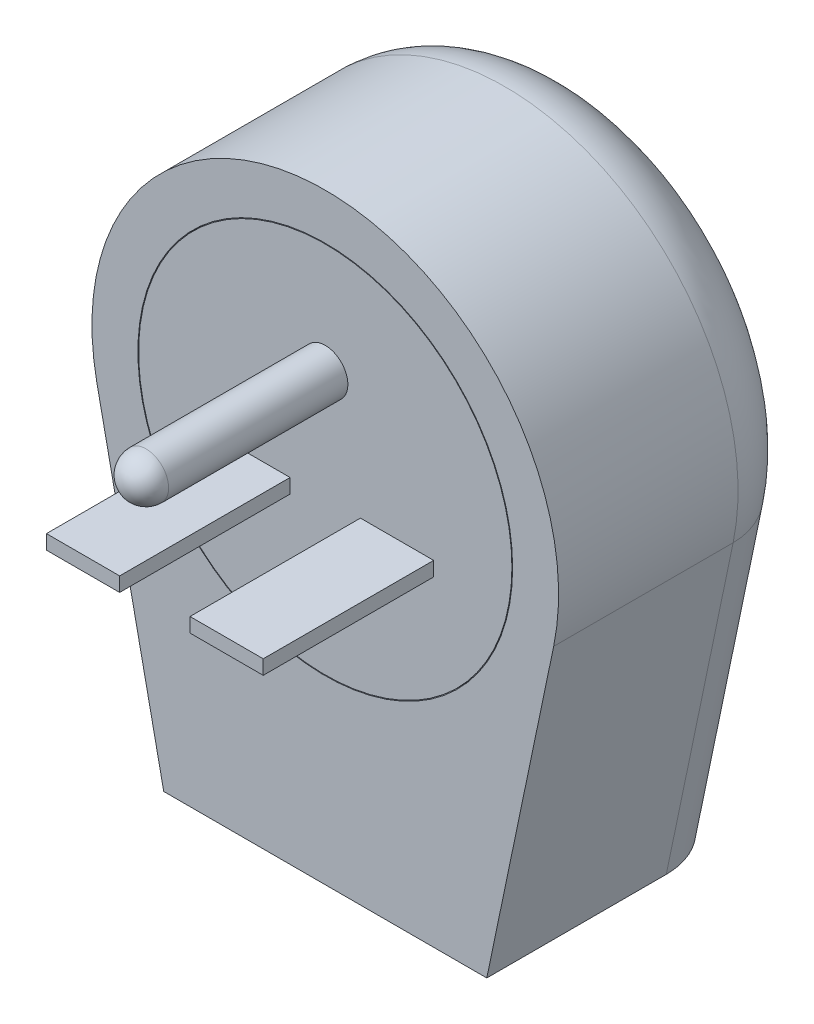
ISO-10303-21;
HEADER;
FILE_DESCRIPTION(('STEP AP214'),'2;1');
FILE_NAME('part.step','',(''),(''),'','','');
FILE_SCHEMA(('AUTOMOTIVE_DESIGN { 1 0 10303 214 1 1 1 1 }'));
ENDSEC;
DATA;
#1=APPLICATION_CONTEXT('core data for automotive mechanical design processes');
#2=APPLICATION_PROTOCOL_DEFINITION('international standard','automotive_design',2000,#1);
#3=PRODUCT_CONTEXT('',#1,'mechanical');
#4=PRODUCT('Part','Part','',(#3));
#5=PRODUCT_RELATED_PRODUCT_CATEGORY('part','',(#4));
#6=PRODUCT_DEFINITION_FORMATION('','',#4);
#7=PRODUCT_DEFINITION_CONTEXT('part definition',#1,'design');
#8=PRODUCT_DEFINITION('design','',#6,#7);
#9=PRODUCT_DEFINITION_SHAPE('','',#8);
#10=(LENGTH_UNIT() NAMED_UNIT(*) SI_UNIT(.MILLI.,.METRE.));
#11=(NAMED_UNIT(*) PLANE_ANGLE_UNIT() SI_UNIT($,.RADIAN.));
#12=(NAMED_UNIT(*) SI_UNIT($,.STERADIAN.) SOLID_ANGLE_UNIT());
#13=UNCERTAINTY_MEASURE_WITH_UNIT(LENGTH_MEASURE(1.E-05),#10,'distance_accuracy_value','');
#14=(GEOMETRIC_REPRESENTATION_CONTEXT(3) GLOBAL_UNCERTAINTY_ASSIGNED_CONTEXT((#13)) GLOBAL_UNIT_ASSIGNED_CONTEXT((#10,
#11,#12)) REPRESENTATION_CONTEXT('',''));
#15=CARTESIAN_POINT('',(0.,0.,0.));
#16=DIRECTION('',(0.,0.,1.));
#17=DIRECTION('',(1.,0.,0.));
#18=AXIS2_PLACEMENT_3D('',#15,#16,#17);
#19=CARTESIAN_POINT('',(28.575,-65.151,-44.45));
#20=DIRECTION('',(0.,1.,0.));
#21=DIRECTION('',(0.,0.,1.));
#22=AXIS2_PLACEMENT_3D('',#19,#20,#21);
#23=PLANE('',#22);
#24=CARTESIAN_POINT('',(-15.6017218825895,-65.151,-31.75));
#25=DIRECTION('',(0.,-1.,0.));
#26=DIRECTION('',(1.,0.,0.));
#27=AXIS2_PLACEMENT_3D('',#24,#25,#26);
#28=ELLIPSE('',#27,12.9732781174105,12.7);
#29=CARTESIAN_POINT('',(-15.6017218825895,-65.151,-44.45));
#30=VERTEX_POINT('',#29);
#31=CARTESIAN_POINT('',(-28.575,-65.151,-31.75));
#32=VERTEX_POINT('',#31);
#33=EDGE_CURVE('P0_E92',#30,#32,#28,.F.);
#34=ORIENTED_EDGE('',*,*,#33,.F.);
#35=DIRECTION('',(-1.,0.,0.));
#36=VECTOR('',#35,1.);
#37=CARTESIAN_POINT('',(28.575,-65.151,-44.45));
#38=LINE('',#37,#36);
#39=CARTESIAN_POINT('',(15.6017218825895,-65.151,-44.45));
#40=VERTEX_POINT('',#39);
#41=EDGE_CURVE('P0_E103',#40,#30,#38,.T.);
#42=ORIENTED_EDGE('',*,*,#41,.F.);
#43=CARTESIAN_POINT('',(15.6017218825895,-65.151,-31.75));
#44=DIRECTION('',(0.,-1.,0.));
#45=DIRECTION('',(-1.,0.,0.));
#46=AXIS2_PLACEMENT_3D('',#43,#44,#45);
#47=ELLIPSE('',#46,12.9732781174105,12.7);
#48=CARTESIAN_POINT('',(28.575,-65.151,-31.75));
#49=VERTEX_POINT('',#48);
#50=EDGE_CURVE('P0_E156',#40,#49,#47,.T.);
#51=ORIENTED_EDGE('',*,*,#50,.T.);
#52=DIRECTION('',(0.,0.,1.));
#53=VECTOR('',#52,1.);
#54=CARTESIAN_POINT('',(28.575,-65.151,-44.45));
#55=LINE('',#54,#53);
#56=CARTESIAN_POINT('',(28.575,-65.151,0.));
#57=VERTEX_POINT('',#56);
#58=EDGE_CURVE('P0_E101',#49,#57,#55,.T.);
#59=ORIENTED_EDGE('',*,*,#58,.T.);
#60=DIRECTION('',(1.,0.,0.));
#61=VECTOR('',#60,1.);
#62=CARTESIAN_POINT('',(-28.575,-65.151,0.));
#63=LINE('',#62,#61);
#64=CARTESIAN_POINT('',(-28.575,-65.151,0.));
#65=VERTEX_POINT('',#64);
#66=EDGE_CURVE('P0_E154',#65,#57,#63,.T.);
#67=ORIENTED_EDGE('',*,*,#66,.F.);
#68=DIRECTION('',(0.,0.,1.));
#69=VECTOR('',#68,1.);
#70=CARTESIAN_POINT('',(-28.575,-65.151,-44.45));
#71=LINE('',#70,#69);
#72=EDGE_CURVE('P0_E40',#32,#65,#71,.T.);
#73=ORIENTED_EDGE('',*,*,#72,.F.);
#74=EDGE_LOOP('',(#34,#42,#51,#59,#67,#73));
#75=FACE_BOUND('',#74,.T.);
#76=ADVANCED_FACE('P0_F17',(#75),#23,.F.);
#77=CARTESIAN_POINT('',(0.,0.,-44.45));
#78=DIRECTION('',(0.,0.,1.));
#79=DIRECTION('',(1.,0.,0.));
#80=AXIS2_PLACEMENT_3D('',#77,#78,#79);
#81=CYLINDRICAL_SURFACE('',#80,41.275);
#82=CARTESIAN_POINT('',(0.,0.,-31.75));
#83=DIRECTION('',(0.,0.,1.));
#84=DIRECTION('',(1.,0.,0.));
#85=AXIS2_PLACEMENT_3D('',#82,#83,#84);
#86=CIRCLE('',#85,41.275);
#87=CARTESIAN_POINT('',(40.4055548070399,-8.42714457780903,-31.75));
#88=VERTEX_POINT('',#87);
#89=CARTESIAN_POINT('',(-40.4055548070399,-8.42714457780902,-31.75));
#90=VERTEX_POINT('',#89);
#91=EDGE_CURVE('P0_E71',#88,#90,#86,.T.);
#92=ORIENTED_EDGE('',*,*,#91,.T.);
#93=DIRECTION('',(0.,0.,1.));
#94=VECTOR('',#93,1.);
#95=CARTESIAN_POINT('',(-40.4055548070399,-8.42714457780902,-44.45));
#96=LINE('',#95,#94);
#97=CARTESIAN_POINT('',(-40.4055548070399,-8.42714457780903,0.));
#98=VERTEX_POINT('',#97);
#99=EDGE_CURVE('P0_E76',#90,#98,#96,.T.);
#100=ORIENTED_EDGE('',*,*,#99,.T.);
#101=CARTESIAN_POINT('',(0.,0.,0.));
#102=DIRECTION('',(0.,0.,1.));
#103=DIRECTION('',(1.,0.,0.));
#104=AXIS2_PLACEMENT_3D('',#101,#102,#103);
#105=CIRCLE('',#104,41.275);
#106=CARTESIAN_POINT('',(40.4055548070399,-8.42714457780903,0.));
#107=VERTEX_POINT('',#106);
#108=EDGE_CURVE('P0_E175',#107,#98,#105,.T.);
#109=ORIENTED_EDGE('',*,*,#108,.F.);
#110=DIRECTION('',(0.,0.,1.));
#111=VECTOR('',#110,1.);
#112=CARTESIAN_POINT('',(40.4055548070399,-8.42714457780903,-44.45));
#113=LINE('',#112,#111);
#114=EDGE_CURVE('P0_E78',#88,#107,#113,.T.);
#115=ORIENTED_EDGE('',*,*,#114,.F.);
#116=EDGE_LOOP('',(#92,#100,#109,#115));
#117=FACE_BOUND('',#116,.T.);
#118=ADVANCED_FACE('P0_F73',(#117),#81,.T.);
#119=CARTESIAN_POINT('',(0.,0.,0.));
#120=DIRECTION('',(0.,0.,-1.));
#121=DIRECTION('',(-1.,0.,0.));
#122=AXIS2_PLACEMENT_3D('',#119,#120,#121);
#123=PLANE('',#122);
#124=CARTESIAN_POINT('',(0.,0.,0.));
#125=DIRECTION('',(0.,0.,1.));
#126=DIRECTION('',(1.,0.,0.));
#127=AXIS2_PLACEMENT_3D('',#124,#125,#126);
#128=CIRCLE('',#127,33.02);
#129=CARTESIAN_POINT('',(33.02,0.,0.));
#130=VERTEX_POINT('',#129);
#131=EDGE_CURVE('P0_E11',#130,#130,#128,.T.);
#132=ORIENTED_EDGE('',*,*,#131,.T.);
#133=EDGE_LOOP('',(#132));
#134=FACE_BOUND('',#133,.T.);
#135=ADVANCED_FACE('P0_F19',(#134),#123,.F.);
#136=CARTESIAN_POINT('',(0.,0.,0.));
#137=DIRECTION('',(0.,0.,1.));
#138=DIRECTION('',(1.,0.,0.));
#139=AXIS2_PLACEMENT_3D('',#136,#137,#138);
#140=CYLINDRICAL_SURFACE('',#139,33.02);
#141=ORIENTED_EDGE('',*,*,#131,.F.);
#142=EDGE_LOOP('',(#141));
#143=FACE_BOUND('',#142,.T.);
#144=CARTESIAN_POINT('',(0.,0.,-6.35));
#145=DIRECTION('',(0.,0.,-1.));
#146=DIRECTION('',(-1.,0.,0.));
#147=AXIS2_PLACEMENT_3D('',#144,#145,#146);
#148=CIRCLE('',#147,33.02);
#149=CARTESIAN_POINT('',(-33.02,0.,-6.35));
#150=VERTEX_POINT('',#149);
#151=EDGE_CURVE('P0_E25',#150,#150,#148,.T.);
#152=ORIENTED_EDGE('',*,*,#151,.F.);
#153=EDGE_LOOP('',(#152));
#154=FACE_BOUND('',#153,.T.);
#155=ADVANCED_FACE('P0_F112',(#143,#154),#140,.T.);
#156=CARTESIAN_POINT('',(0.,0.,-6.35));
#157=DIRECTION('',(0.,0.,-1.));
#158=DIRECTION('',(-1.,0.,0.));
#159=AXIS2_PLACEMENT_3D('',#156,#157,#158);
#160=PLANE('',#159);
#161=CARTESIAN_POINT('',(0.,0.,-6.35));
#162=DIRECTION('',(0.,0.,1.));
#163=DIRECTION('',(1.,0.,0.));
#164=AXIS2_PLACEMENT_3D('',#161,#162,#163);
#165=CIRCLE('',#164,33.147);
#166=CARTESIAN_POINT('',(33.147,0.,-6.35));
#167=VERTEX_POINT('',#166);
#168=EDGE_CURVE('P0_E159',#167,#167,#165,.T.);
#169=ORIENTED_EDGE('',*,*,#168,.T.);
#170=EDGE_LOOP('',(#169));
#171=FACE_BOUND('',#170,.T.);
#172=ORIENTED_EDGE('',*,*,#151,.T.);
#173=EDGE_LOOP('',(#172));
#174=FACE_BOUND('',#173,.T.);
#175=ADVANCED_FACE('P0_F110',(#171,#174),#160,.F.);
#176=CARTESIAN_POINT('',(0.,0.,0.));
#177=DIRECTION('',(0.,0.,1.));
#178=DIRECTION('',(1.,0.,0.));
#179=AXIS2_PLACEMENT_3D('',#176,#177,#178);
#180=PLANE('',#179);
#181=ORIENTED_EDGE('',*,*,#66,.T.);
#182=DIRECTION('',(0.204170674204943,0.978935307257175,0.));
#183=VECTOR('',#182,1.);
#184=CARTESIAN_POINT('',(28.575,-65.151,0.));
#185=LINE('',#184,#183);
#186=EDGE_CURVE('P0_E150',#57,#107,#185,.T.);
#187=ORIENTED_EDGE('',*,*,#186,.T.);
#188=ORIENTED_EDGE('',*,*,#108,.T.);
#189=DIRECTION('',(0.204170674204943,-0.978935307257175,0.));
#190=VECTOR('',#189,1.);
#191=CARTESIAN_POINT('',(-40.4055548070399,-8.42714457780903,0.));
#192=LINE('',#191,#190);
#193=EDGE_CURVE('P0_E99',#98,#65,#192,.T.);
#194=ORIENTED_EDGE('',*,*,#193,.T.);
#195=EDGE_LOOP('',(#181,#187,#188,#194));
#196=FACE_BOUND('',#195,.T.);
#197=CARTESIAN_POINT('',(0.,0.,0.));
#198=DIRECTION('',(0.,0.,1.));
#199=DIRECTION('',(1.,0.,0.));
#200=AXIS2_PLACEMENT_3D('',#197,#198,#199);
#201=CIRCLE('',#200,33.147);
#202=CARTESIAN_POINT('',(33.147,0.,0.));
#203=VERTEX_POINT('',#202);
#204=EDGE_CURVE('P0_E163',#203,#203,#201,.T.);
#205=ORIENTED_EDGE('',*,*,#204,.F.);
#206=EDGE_LOOP('',(#205));
#207=FACE_BOUND('',#206,.T.);
#208=ADVANCED_FACE('P0_F121',(#196,#207),#180,.T.);
#209=CARTESIAN_POINT('',(0.,0.,0.));
#210=DIRECTION('',(0.,0.,-1.));
#211=DIRECTION('',(-1.,0.,0.));
#212=AXIS2_PLACEMENT_3D('',#209,#210,#211);
#213=CYLINDRICAL_SURFACE('',#212,33.147);
#214=ORIENTED_EDGE('',*,*,#204,.T.);
#215=EDGE_LOOP('',(#214));
#216=FACE_BOUND('',#215,.T.);
#217=ORIENTED_EDGE('',*,*,#168,.F.);
#218=EDGE_LOOP('',(#217));
#219=FACE_BOUND('',#218,.T.);
#220=ADVANCED_FACE('P0_F180',(#216,#219),#213,.F.);
#221=CARTESIAN_POINT('',(0.,0.,-44.45));
#222=DIRECTION('',(0.,0.,-1.));
#223=DIRECTION('',(-1.,0.,0.));
#224=AXIS2_PLACEMENT_3D('',#221,#222,#223);
#225=PLANE('',#224);
#226=DIRECTION('',(0.204170674204943,-0.978935307257175,0.));
#227=VECTOR('',#226,1.);
#228=CARTESIAN_POINT('',(-27.9730764048738,-5.83417701540624,-44.45));
#229=LINE('',#228,#227);
#230=CARTESIAN_POINT('',(-27.9730764048738,-5.83417701540624,-44.45));
#231=VERTEX_POINT('',#230);
#232=EDGE_CURVE('P0_E93',#231,#30,#229,.T.);
#233=ORIENTED_EDGE('',*,*,#232,.F.);
#234=CARTESIAN_POINT('',(0.,0.,-44.45));
#235=DIRECTION('',(0.,0.,1.));
#236=DIRECTION('',(1.,0.,0.));
#237=AXIS2_PLACEMENT_3D('',#234,#235,#236);
#238=CIRCLE('',#237,28.575);
#239=CARTESIAN_POINT('',(27.9730764048738,-5.83417701540624,-44.45));
#240=VERTEX_POINT('',#239);
#241=EDGE_CURVE('P0_E83',#240,#231,#238,.T.);
#242=ORIENTED_EDGE('',*,*,#241,.F.);
#243=DIRECTION('',(-0.204170674204943,-0.978935307257175,0.));
#244=VECTOR('',#243,1.);
#245=CARTESIAN_POINT('',(27.9730764048738,-5.83417701540624,-44.45));
#246=LINE('',#245,#244);
#247=EDGE_CURVE('P0_E160',#240,#40,#246,.T.);
#248=ORIENTED_EDGE('',*,*,#247,.T.);
#249=ORIENTED_EDGE('',*,*,#41,.T.);
#250=EDGE_LOOP('',(#233,#242,#248,#249));
#251=FACE_BOUND('',#250,.T.);
#252=ADVANCED_FACE('P0_F146',(#251),#225,.T.);
#253=CARTESIAN_POINT('',(-28.575,-65.151,-44.45));
#254=DIRECTION('',(0.978935307257175,0.204170674204943,0.));
#255=DIRECTION('',(-0.204170674204943,0.978935307257175,0.));
#256=AXIS2_PLACEMENT_3D('',#253,#254,#255);
#257=PLANE('',#256);
#258=ORIENTED_EDGE('',*,*,#99,.F.);
#259=DIRECTION('',(0.204170674204943,-0.978935307257175,0.));
#260=VECTOR('',#259,1.);
#261=CARTESIAN_POINT('',(-40.4055548070399,-8.42714457780902,-31.75));
#262=LINE('',#261,#260);
#263=EDGE_CURVE('P0_E87',#90,#32,#262,.T.);
#264=ORIENTED_EDGE('',*,*,#263,.T.);
#265=ORIENTED_EDGE('',*,*,#72,.T.);
#266=ORIENTED_EDGE('',*,*,#193,.F.);
#267=EDGE_LOOP('',(#258,#264,#265,#266));
#268=FACE_BOUND('',#267,.T.);
#269=ADVANCED_FACE('P0_F98',(#268),#257,.F.);
#270=CARTESIAN_POINT('',(28.575,-65.151,-44.45));
#271=DIRECTION('',(-0.978935307257175,0.204170674204943,0.));
#272=DIRECTION('',(-0.204170674204943,-0.978935307257175,0.));
#273=AXIS2_PLACEMENT_3D('',#270,#271,#272);
#274=PLANE('',#273);
#275=ORIENTED_EDGE('',*,*,#58,.F.);
#276=DIRECTION('',(-0.204170674204943,-0.978935307257175,0.));
#277=VECTOR('',#276,1.);
#278=CARTESIAN_POINT('',(40.4055548070399,-8.42714457780902,-31.75));
#279=LINE('',#278,#277);
#280=EDGE_CURVE('P0_E82',#88,#49,#279,.T.);
#281=ORIENTED_EDGE('',*,*,#280,.F.);
#282=ORIENTED_EDGE('',*,*,#114,.T.);
#283=ORIENTED_EDGE('',*,*,#186,.F.);
#284=EDGE_LOOP('',(#275,#281,#282,#283));
#285=FACE_BOUND('',#284,.T.);
#286=ADVANCED_FACE('P0_F136',(#285),#274,.F.);
#287=CARTESIAN_POINT('',(27.9730764048738,-5.83417701540624,-31.75));
#288=DIRECTION('',(-0.204170674204943,-0.978935307257175,0.));
#289=DIRECTION('',(0.978935307257175,-0.204170674204943,0.));
#290=AXIS2_PLACEMENT_3D('',#287,#288,#289);
#291=CYLINDRICAL_SURFACE('',#290,12.7);
#292=ORIENTED_EDGE('',*,*,#247,.F.);
#293=CARTESIAN_POINT('',(27.9730764048738,-5.83417701540624,-31.75));
#294=DIRECTION('',(0.204170674204943,0.978935307257175,0.));
#295=DIRECTION('',(0.,0.,1.));
#296=AXIS2_PLACEMENT_3D('',#293,#294,#295);
#297=CIRCLE('',#296,12.7);
#298=EDGE_CURVE('P0_E32',#88,#240,#297,.T.);
#299=ORIENTED_EDGE('',*,*,#298,.F.);
#300=ORIENTED_EDGE('',*,*,#280,.T.);
#301=ORIENTED_EDGE('',*,*,#50,.F.);
#302=EDGE_LOOP('',(#292,#299,#300,#301));
#303=FACE_BOUND('',#302,.T.);
#304=ADVANCED_FACE('P0_F138',(#303),#291,.T.);
#305=CARTESIAN_POINT('',(0.,0.,-31.75));
#306=DIRECTION('',(0.,0.,1.));
#307=DIRECTION('',(1.,0.,0.));
#308=AXIS2_PLACEMENT_3D('',#305,#306,#307);
#309=TOROIDAL_SURFACE('',#308,28.575,12.7);
#310=ORIENTED_EDGE('',*,*,#91,.F.);
#311=ORIENTED_EDGE('',*,*,#298,.T.);
#312=ORIENTED_EDGE('',*,*,#241,.T.);
#313=CARTESIAN_POINT('',(-27.9730764048738,-5.83417701540624,-31.75));
#314=DIRECTION('',(0.204170674204943,-0.978935307257175,0.));
#315=DIRECTION('',(0.,0.,1.));
#316=AXIS2_PLACEMENT_3D('',#313,#314,#315);
#317=CIRCLE('',#316,12.7);
#318=EDGE_CURVE('P0_E89',#90,#231,#317,.T.);
#319=ORIENTED_EDGE('',*,*,#318,.F.);
#320=EDGE_LOOP('',(#310,#311,#312,#319));
#321=FACE_BOUND('',#320,.T.);
#322=ADVANCED_FACE('P0_F95',(#321),#309,.T.);
#323=CARTESIAN_POINT('',(-27.9730764048738,-5.83417701540624,-31.75));
#324=DIRECTION('',(0.204170674204943,-0.978935307257175,0.));
#325=DIRECTION('',(0.978935307257175,0.204170674204943,0.));
#326=AXIS2_PLACEMENT_3D('',#323,#324,#325);
#327=CYLINDRICAL_SURFACE('',#326,12.7);
#328=ORIENTED_EDGE('',*,*,#33,.T.);
#329=ORIENTED_EDGE('',*,*,#263,.F.);
#330=ORIENTED_EDGE('',*,*,#318,.T.);
#331=ORIENTED_EDGE('',*,*,#232,.T.);
#332=EDGE_LOOP('',(#328,#329,#330,#331));
#333=FACE_BOUND('',#332,.T.);
#334=ADVANCED_FACE('P0_F88',(#333),#327,.T.);
#335=CLOSED_SHELL('',(#76,#118,#135,#155,#175,#208,#220,#252,#269,#286,#304,#322,#334));
#336=MANIFOLD_SOLID_BREP('P0_B1',#335);
#337=CARTESIAN_POINT('',(-19.177,-8.4074,30.1498));
#338=DIRECTION('',(1.,0.,0.));
#339=DIRECTION('',(0.,1.,0.));
#340=AXIS2_PLACEMENT_3D('',#337,#338,#339);
#341=PLANE('',#340);
#342=DIRECTION('',(0.,-1.,0.));
#343=VECTOR('',#342,1.);
#344=CARTESIAN_POINT('',(-19.177,-8.4074,0.));
#345=LINE('',#344,#343);
#346=CARTESIAN_POINT('',(-19.177,-5.8674,0.));
#347=VERTEX_POINT('',#346);
#348=CARTESIAN_POINT('',(-19.177,-8.4074,0.));
#349=VERTEX_POINT('',#348);
#350=EDGE_CURVE('P1_E80',#347,#349,#345,.T.);
#351=ORIENTED_EDGE('',*,*,#350,.T.);
#352=DIRECTION('',(0.,0.,-1.));
#353=VECTOR('',#352,1.);
#354=CARTESIAN_POINT('',(-19.177,-8.4074,30.1498));
#355=LINE('',#354,#353);
#356=CARTESIAN_POINT('',(-19.177,-8.4074,30.1498));
#357=VERTEX_POINT('',#356);
#358=EDGE_CURVE('P1_E11',#357,#349,#355,.T.);
#359=ORIENTED_EDGE('',*,*,#358,.F.);
#360=DIRECTION('',(0.,-1.,0.));
#361=VECTOR('',#360,1.);
#362=CARTESIAN_POINT('',(-19.177,-8.4074,30.1498));
#363=LINE('',#362,#361);
#364=CARTESIAN_POINT('',(-19.177,-5.8674,30.1498));
#365=VERTEX_POINT('',#364);
#366=EDGE_CURVE('P1_E68',#365,#357,#363,.T.);
#367=ORIENTED_EDGE('',*,*,#366,.F.);
#368=DIRECTION('',(0.,0.,-1.));
#369=VECTOR('',#368,1.);
#370=CARTESIAN_POINT('',(-19.177,-5.8674,30.1498));
#371=LINE('',#370,#369);
#372=EDGE_CURVE('P1_E76',#365,#347,#371,.T.);
#373=ORIENTED_EDGE('',*,*,#372,.T.);
#374=EDGE_LOOP('',(#351,#359,#367,#373));
#375=FACE_BOUND('',#374,.T.);
#376=ADVANCED_FACE('P1_F17',(#375),#341,.F.);
#377=CARTESIAN_POINT('',(-19.177,-8.4074,30.1498));
#378=DIRECTION('',(0.,1.,0.));
#379=DIRECTION('',(0.,0.,1.));
#380=AXIS2_PLACEMENT_3D('',#377,#378,#379);
#381=PLANE('',#380);
#382=DIRECTION('',(1.,0.,0.));
#383=VECTOR('',#382,1.);
#384=CARTESIAN_POINT('',(-19.177,-8.4074,0.));
#385=LINE('',#384,#383);
#386=CARTESIAN_POINT('',(-6.22299999999998,-8.4074,0.));
#387=VERTEX_POINT('',#386);
#388=EDGE_CURVE('P1_E72',#349,#387,#385,.T.);
#389=ORIENTED_EDGE('',*,*,#388,.T.);
#390=DIRECTION('',(0.,0.,-1.));
#391=VECTOR('',#390,1.);
#392=CARTESIAN_POINT('',(-6.22299999999998,-8.4074,30.1498));
#393=LINE('',#392,#391);
#394=CARTESIAN_POINT('',(-6.22299999999998,-8.4074,30.1498));
#395=VERTEX_POINT('',#394);
#396=EDGE_CURVE('P1_E25',#395,#387,#393,.T.);
#397=ORIENTED_EDGE('',*,*,#396,.F.);
#398=DIRECTION('',(1.,0.,0.));
#399=VECTOR('',#398,1.);
#400=CARTESIAN_POINT('',(-19.177,-8.4074,30.1498));
#401=LINE('',#400,#399);
#402=EDGE_CURVE('P1_E63',#357,#395,#401,.T.);
#403=ORIENTED_EDGE('',*,*,#402,.F.);
#404=ORIENTED_EDGE('',*,*,#358,.T.);
#405=EDGE_LOOP('',(#389,#397,#403,#404));
#406=FACE_BOUND('',#405,.T.);
#407=ADVANCED_FACE('P1_F71',(#406),#381,.F.);
#408=CARTESIAN_POINT('',(-6.22299999999998,-8.4074,30.1498));
#409=DIRECTION('',(-1.,0.,0.));
#410=DIRECTION('',(0.,-1.,0.));
#411=AXIS2_PLACEMENT_3D('',#408,#409,#410);
#412=PLANE('',#411);
#413=DIRECTION('',(0.,1.,0.));
#414=VECTOR('',#413,1.);
#415=CARTESIAN_POINT('',(-6.22299999999998,-8.4074,0.));
#416=LINE('',#415,#414);
#417=CARTESIAN_POINT('',(-6.22299999999998,-5.8674,0.));
#418=VERTEX_POINT('',#417);
#419=EDGE_CURVE('P1_E50',#387,#418,#416,.T.);
#420=ORIENTED_EDGE('',*,*,#419,.T.);
#421=DIRECTION('',(0.,0.,-1.));
#422=VECTOR('',#421,1.);
#423=CARTESIAN_POINT('',(-6.22299999999998,-5.8674,30.1498));
#424=LINE('',#423,#422);
#425=CARTESIAN_POINT('',(-6.22299999999998,-5.8674,30.1498));
#426=VERTEX_POINT('',#425);
#427=EDGE_CURVE('P1_E73',#426,#418,#424,.T.);
#428=ORIENTED_EDGE('',*,*,#427,.F.);
#429=DIRECTION('',(0.,1.,0.));
#430=VECTOR('',#429,1.);
#431=CARTESIAN_POINT('',(-6.22299999999998,-8.4074,30.1498));
#432=LINE('',#431,#430);
#433=EDGE_CURVE('P1_E66',#395,#426,#432,.T.);
#434=ORIENTED_EDGE('',*,*,#433,.F.);
#435=ORIENTED_EDGE('',*,*,#396,.T.);
#436=EDGE_LOOP('',(#420,#428,#434,#435));
#437=FACE_BOUND('',#436,.T.);
#438=ADVANCED_FACE('P1_F74',(#437),#412,.F.);
#439=CARTESIAN_POINT('',(-19.177,-5.8674,30.1498));
#440=DIRECTION('',(0.,-1.,0.));
#441=DIRECTION('',(0.,0.,-1.));
#442=AXIS2_PLACEMENT_3D('',#439,#440,#441);
#443=PLANE('',#442);
#444=DIRECTION('',(-1.,0.,0.));
#445=VECTOR('',#444,1.);
#446=CARTESIAN_POINT('',(-19.177,-5.8674,0.));
#447=LINE('',#446,#445);
#448=EDGE_CURVE('P1_E56',#418,#347,#447,.T.);
#449=ORIENTED_EDGE('',*,*,#448,.T.);
#450=ORIENTED_EDGE('',*,*,#372,.F.);
#451=DIRECTION('',(-1.,0.,0.));
#452=VECTOR('',#451,1.);
#453=CARTESIAN_POINT('',(-19.177,-5.8674,30.1498));
#454=LINE('',#453,#452);
#455=EDGE_CURVE('P1_E33',#426,#365,#454,.T.);
#456=ORIENTED_EDGE('',*,*,#455,.F.);
#457=ORIENTED_EDGE('',*,*,#427,.T.);
#458=EDGE_LOOP('',(#449,#450,#456,#457));
#459=FACE_BOUND('',#458,.T.);
#460=ADVANCED_FACE('P1_F87',(#459),#443,.F.);
#461=CARTESIAN_POINT('',(-19.177,-5.8674,30.1498));
#462=DIRECTION('',(0.,0.,-1.));
#463=DIRECTION('',(-1.,0.,0.));
#464=AXIS2_PLACEMENT_3D('',#461,#462,#463);
#465=PLANE('',#464);
#466=ORIENTED_EDGE('',*,*,#366,.T.);
#467=ORIENTED_EDGE('',*,*,#402,.T.);
#468=ORIENTED_EDGE('',*,*,#433,.T.);
#469=ORIENTED_EDGE('',*,*,#455,.T.);
#470=EDGE_LOOP('',(#466,#467,#468,#469));
#471=FACE_BOUND('',#470,.T.);
#472=ADVANCED_FACE('P1_F64',(#471),#465,.F.);
#473=CARTESIAN_POINT('',(-19.177,-5.8674,0.));
#474=DIRECTION('',(0.,0.,-1.));
#475=DIRECTION('',(-1.,0.,0.));
#476=AXIS2_PLACEMENT_3D('',#473,#474,#475);
#477=PLANE('',#476);
#478=ORIENTED_EDGE('',*,*,#350,.F.);
#479=ORIENTED_EDGE('',*,*,#448,.F.);
#480=ORIENTED_EDGE('',*,*,#419,.F.);
#481=ORIENTED_EDGE('',*,*,#388,.F.);
#482=EDGE_LOOP('',(#478,#479,#480,#481));
#483=FACE_BOUND('',#482,.T.);
#484=ADVANCED_FACE('P1_F90',(#483),#477,.T.);
#485=CLOSED_SHELL('',(#376,#407,#438,#460,#472,#484));
#486=MANIFOLD_SOLID_BREP('P1_B1',#485);
#487=CARTESIAN_POINT('',(19.177,-8.40739999999999,30.1498));
#488=DIRECTION('',(-1.,0.,0.));
#489=DIRECTION('',(0.,0.,1.));
#490=AXIS2_PLACEMENT_3D('',#487,#488,#489);
#491=PLANE('',#490);
#492=DIRECTION('',(0.,1.,0.));
#493=VECTOR('',#492,1.);
#494=CARTESIAN_POINT('',(19.177,-8.40739999999999,0.));
#495=LINE('',#494,#493);
#496=CARTESIAN_POINT('',(19.177,-8.40739999999999,0.));
#497=VERTEX_POINT('',#496);
#498=CARTESIAN_POINT('',(19.177,-5.86739999999999,0.));
#499=VERTEX_POINT('',#498);
#500=EDGE_CURVE('P2_E80',#497,#499,#495,.T.);
#501=ORIENTED_EDGE('',*,*,#500,.T.);
#502=DIRECTION('',(0.,0.,-1.));
#503=VECTOR('',#502,1.);
#504=CARTESIAN_POINT('',(19.177,-5.86739999999999,30.1498));
#505=LINE('',#504,#503);
#506=CARTESIAN_POINT('',(19.177,-5.86739999999999,30.1498));
#507=VERTEX_POINT('',#506);
#508=EDGE_CURVE('P2_E11',#507,#499,#505,.T.);
#509=ORIENTED_EDGE('',*,*,#508,.F.);
#510=DIRECTION('',(0.,1.,0.));
#511=VECTOR('',#510,1.);
#512=CARTESIAN_POINT('',(19.177,-8.40739999999999,30.1498));
#513=LINE('',#512,#511);
#514=CARTESIAN_POINT('',(19.177,-8.40739999999999,30.1498));
#515=VERTEX_POINT('',#514);
#516=EDGE_CURVE('P2_E68',#515,#507,#513,.T.);
#517=ORIENTED_EDGE('',*,*,#516,.F.);
#518=DIRECTION('',(0.,0.,-1.));
#519=VECTOR('',#518,1.);
#520=CARTESIAN_POINT('',(19.177,-8.40739999999999,30.1498));
#521=LINE('',#520,#519);
#522=EDGE_CURVE('P2_E76',#515,#497,#521,.T.);
#523=ORIENTED_EDGE('',*,*,#522,.T.);
#524=EDGE_LOOP('',(#501,#509,#517,#523));
#525=FACE_BOUND('',#524,.T.);
#526=ADVANCED_FACE('P2_F17',(#525),#491,.F.);
#527=CARTESIAN_POINT('',(19.177,-5.86739999999999,30.1498));
#528=DIRECTION('',(0.,-1.,0.));
#529=DIRECTION('',(1.,0.,0.));
#530=AXIS2_PLACEMENT_3D('',#527,#528,#529);
#531=PLANE('',#530);
#532=DIRECTION('',(-1.,0.,0.));
#533=VECTOR('',#532,1.);
#534=CARTESIAN_POINT('',(19.177,-5.86739999999999,0.));
#535=LINE('',#534,#533);
#536=CARTESIAN_POINT('',(6.22299999999998,-5.8674,0.));
#537=VERTEX_POINT('',#536);
#538=EDGE_CURVE('P2_E72',#499,#537,#535,.T.);
#539=ORIENTED_EDGE('',*,*,#538,.T.);
#540=DIRECTION('',(0.,0.,-1.));
#541=VECTOR('',#540,1.);
#542=CARTESIAN_POINT('',(6.22299999999998,-5.8674,30.1498));
#543=LINE('',#542,#541);
#544=CARTESIAN_POINT('',(6.22299999999998,-5.8674,30.1498));
#545=VERTEX_POINT('',#544);
#546=EDGE_CURVE('P2_E25',#545,#537,#543,.T.);
#547=ORIENTED_EDGE('',*,*,#546,.F.);
#548=DIRECTION('',(-1.,0.,0.));
#549=VECTOR('',#548,1.);
#550=CARTESIAN_POINT('',(19.177,-5.86739999999999,30.1498));
#551=LINE('',#550,#549);
#552=EDGE_CURVE('P2_E63',#507,#545,#551,.T.);
#553=ORIENTED_EDGE('',*,*,#552,.F.);
#554=ORIENTED_EDGE('',*,*,#508,.T.);
#555=EDGE_LOOP('',(#539,#547,#553,#554));
#556=FACE_BOUND('',#555,.T.);
#557=ADVANCED_FACE('P2_F71',(#556),#531,.F.);
#558=CARTESIAN_POINT('',(6.22299999999998,-8.40740000000001,30.1498));
#559=DIRECTION('',(1.,0.,0.));
#560=DIRECTION('',(0.,1.,0.));
#561=AXIS2_PLACEMENT_3D('',#558,#559,#560);
#562=PLANE('',#561);
#563=DIRECTION('',(0.,-1.,0.));
#564=VECTOR('',#563,1.);
#565=CARTESIAN_POINT('',(6.22299999999998,-8.40740000000001,0.));
#566=LINE('',#565,#564);
#567=CARTESIAN_POINT('',(6.22299999999998,-8.40740000000001,0.));
#568=VERTEX_POINT('',#567);
#569=EDGE_CURVE('P2_E50',#537,#568,#566,.T.);
#570=ORIENTED_EDGE('',*,*,#569,.T.);
#571=DIRECTION('',(0.,0.,-1.));
#572=VECTOR('',#571,1.);
#573=CARTESIAN_POINT('',(6.22299999999998,-8.40740000000001,30.1498));
#574=LINE('',#573,#572);
#575=CARTESIAN_POINT('',(6.22299999999998,-8.40740000000001,30.1498));
#576=VERTEX_POINT('',#575);
#577=EDGE_CURVE('P2_E73',#576,#568,#574,.T.);
#578=ORIENTED_EDGE('',*,*,#577,.F.);
#579=DIRECTION('',(0.,-1.,0.));
#580=VECTOR('',#579,1.);
#581=CARTESIAN_POINT('',(6.22299999999998,-8.40740000000001,30.1498));
#582=LINE('',#581,#580);
#583=EDGE_CURVE('P2_E66',#545,#576,#582,.T.);
#584=ORIENTED_EDGE('',*,*,#583,.F.);
#585=ORIENTED_EDGE('',*,*,#546,.T.);
#586=EDGE_LOOP('',(#570,#578,#584,#585));
#587=FACE_BOUND('',#586,.T.);
#588=ADVANCED_FACE('P2_F74',(#587),#562,.F.);
#589=CARTESIAN_POINT('',(19.177,-8.40739999999999,30.1498));
#590=DIRECTION('',(0.,1.,0.));
#591=DIRECTION('',(-1.,0.,0.));
#592=AXIS2_PLACEMENT_3D('',#589,#590,#591);
#593=PLANE('',#592);
#594=DIRECTION('',(1.,0.,0.));
#595=VECTOR('',#594,1.);
#596=CARTESIAN_POINT('',(19.177,-8.40739999999999,0.));
#597=LINE('',#596,#595);
#598=EDGE_CURVE('P2_E56',#568,#497,#597,.T.);
#599=ORIENTED_EDGE('',*,*,#598,.T.);
#600=ORIENTED_EDGE('',*,*,#522,.F.);
#601=DIRECTION('',(1.,0.,0.));
#602=VECTOR('',#601,1.);
#603=CARTESIAN_POINT('',(19.177,-8.40739999999999,30.1498));
#604=LINE('',#603,#602);
#605=EDGE_CURVE('P2_E33',#576,#515,#604,.T.);
#606=ORIENTED_EDGE('',*,*,#605,.F.);
#607=ORIENTED_EDGE('',*,*,#577,.T.);
#608=EDGE_LOOP('',(#599,#600,#606,#607));
#609=FACE_BOUND('',#608,.T.);
#610=ADVANCED_FACE('P2_F87',(#609),#593,.F.);
#611=CARTESIAN_POINT('',(19.177,-5.86739999999999,30.1498));
#612=DIRECTION('',(0.,0.,1.));
#613=DIRECTION('',(1.,0.,0.));
#614=AXIS2_PLACEMENT_3D('',#611,#612,#613);
#615=PLANE('',#614);
#616=ORIENTED_EDGE('',*,*,#516,.T.);
#617=ORIENTED_EDGE('',*,*,#552,.T.);
#618=ORIENTED_EDGE('',*,*,#583,.T.);
#619=ORIENTED_EDGE('',*,*,#605,.T.);
#620=EDGE_LOOP('',(#616,#617,#618,#619));
#621=FACE_BOUND('',#620,.T.);
#622=ADVANCED_FACE('P2_F64',(#621),#615,.T.);
#623=CARTESIAN_POINT('',(19.177,-5.86739999999999,0.));
#624=DIRECTION('',(0.,0.,1.));
#625=DIRECTION('',(1.,0.,0.));
#626=AXIS2_PLACEMENT_3D('',#623,#624,#625);
#627=PLANE('',#626);
#628=ORIENTED_EDGE('',*,*,#500,.F.);
#629=ORIENTED_EDGE('',*,*,#598,.F.);
#630=ORIENTED_EDGE('',*,*,#569,.F.);
#631=ORIENTED_EDGE('',*,*,#538,.F.);
#632=EDGE_LOOP('',(#628,#629,#630,#631));
#633=FACE_BOUND('',#632,.T.);
#634=ADVANCED_FACE('P2_F90',(#633),#627,.F.);
#635=CLOSED_SHELL('',(#526,#557,#588,#610,#622,#634));
#636=MANIFOLD_SOLID_BREP('P2_B1',#635);
#637=CARTESIAN_POINT('',(0.,13.4874,0.));
#638=DIRECTION('',(0.,0.,-1.));
#639=DIRECTION('',(0.,1.,0.));
#640=AXIS2_PLACEMENT_3D('',#637,#638,#639);
#641=PLANE('',#640);
#642=CARTESIAN_POINT('',(0.,13.4874,0.));
#643=DIRECTION('',(0.,0.,-1.));
#644=DIRECTION('',(0.,1.,0.));
#645=AXIS2_PLACEMENT_3D('',#642,#643,#644);
#646=CIRCLE('',#645,4.0005);
#647=CARTESIAN_POINT('',(0.,17.4879,0.));
#648=VERTEX_POINT('',#647);
#649=EDGE_CURVE('P3_E20',#648,#648,#646,.T.);
#650=ORIENTED_EDGE('',*,*,#649,.T.);
#651=EDGE_LOOP('',(#650));
#652=FACE_BOUND('',#651,.T.);
#653=ADVANCED_FACE('P3_F14',(#652),#641,.T.);
#654=CARTESIAN_POINT('',(0.,13.4874,31.7119));
#655=DIRECTION('',(0.,0.,-1.));
#656=DIRECTION('',(0.,1.,0.));
#657=AXIS2_PLACEMENT_3D('',#654,#655,#656);
#658=SPHERICAL_SURFACE('',#657,4.00049999999999);
#659=CARTESIAN_POINT('',(0.,13.4874,31.7119));
#660=DIRECTION('',(0.,0.,-1.));
#661=DIRECTION('',(0.,1.,0.));
#662=AXIS2_PLACEMENT_3D('',#659,#660,#661);
#663=CIRCLE('',#662,4.0005);
#664=CARTESIAN_POINT('',(0.,17.4879,31.7119));
#665=VERTEX_POINT('',#664);
#666=EDGE_CURVE('P3_E9',#665,#665,#663,.T.);
#667=ORIENTED_EDGE('',*,*,#666,.F.);
#668=EDGE_LOOP('',(#667));
#669=FACE_BOUND('',#668,.T.);
#670=ADVANCED_FACE('P3_F29',(#669),#658,.T.);
#671=CARTESIAN_POINT('',(0.,13.4874,0.));
#672=DIRECTION('',(0.,0.,-1.));
#673=DIRECTION('',(0.,1.,0.));
#674=AXIS2_PLACEMENT_3D('',#671,#672,#673);
#675=CYLINDRICAL_SURFACE('',#674,4.0005);
#676=ORIENTED_EDGE('',*,*,#666,.T.);
#677=EDGE_LOOP('',(#676));
#678=FACE_BOUND('',#677,.T.);
#679=ORIENTED_EDGE('',*,*,#649,.F.);
#680=EDGE_LOOP('',(#679));
#681=FACE_BOUND('',#680,.T.);
#682=ADVANCED_FACE('P3_F27',(#678,#681),#675,.T.);
#683=CLOSED_SHELL('',(#653,#670,#682));
#684=MANIFOLD_SOLID_BREP('P3_B1',#683);
#685=ADVANCED_BREP_SHAPE_REPRESENTATION('',(#18,#336,#486,#636,#684),#14);
#686=SHAPE_DEFINITION_REPRESENTATION(#9,#685);
ENDSEC;
END-ISO-10303-21;
